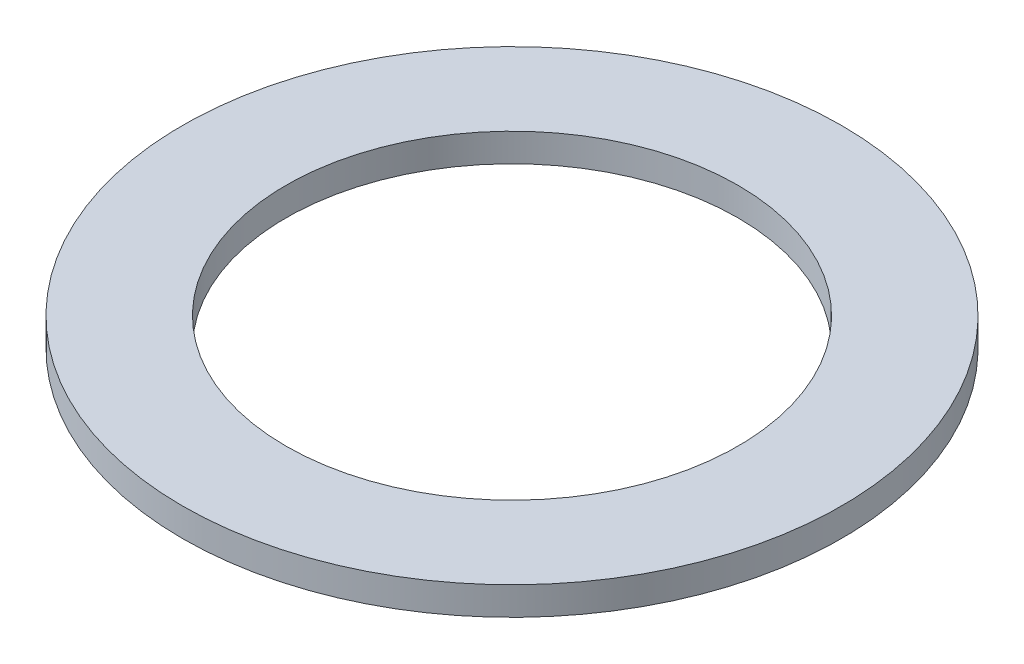
ISO-10303-21;
HEADER;
FILE_DESCRIPTION(('STEP AP214'),'2;1');
FILE_NAME('part.step','',(''),(''),'','','');
FILE_SCHEMA(('AUTOMOTIVE_DESIGN { 1 0 10303 214 1 1 1 1 }'));
ENDSEC;
DATA;
#1=APPLICATION_CONTEXT('core data for automotive mechanical design processes');
#2=APPLICATION_PROTOCOL_DEFINITION('international standard','automotive_design',2000,#1);
#3=PRODUCT_CONTEXT('',#1,'mechanical');
#4=PRODUCT('Part','Part','',(#3));
#5=PRODUCT_RELATED_PRODUCT_CATEGORY('part','',(#4));
#6=PRODUCT_DEFINITION_FORMATION('','',#4);
#7=PRODUCT_DEFINITION_CONTEXT('part definition',#1,'design');
#8=PRODUCT_DEFINITION('design','',#6,#7);
#9=PRODUCT_DEFINITION_SHAPE('','',#8);
#10=(LENGTH_UNIT() NAMED_UNIT(*) SI_UNIT(.MILLI.,.METRE.));
#11=(NAMED_UNIT(*) PLANE_ANGLE_UNIT() SI_UNIT($,.RADIAN.));
#12=(NAMED_UNIT(*) SI_UNIT($,.STERADIAN.) SOLID_ANGLE_UNIT());
#13=UNCERTAINTY_MEASURE_WITH_UNIT(LENGTH_MEASURE(1.E-05),#10,'distance_accuracy_value','');
#14=(GEOMETRIC_REPRESENTATION_CONTEXT(3) GLOBAL_UNCERTAINTY_ASSIGNED_CONTEXT((#13)) GLOBAL_UNIT_ASSIGNED_CONTEXT((#10,
#11,#12)) REPRESENTATION_CONTEXT('',''));
#15=CARTESIAN_POINT('',(0.,0.,0.));
#16=DIRECTION('',(0.,0.,1.));
#17=DIRECTION('',(1.,0.,0.));
#18=AXIS2_PLACEMENT_3D('',#15,#16,#17);
#19=CARTESIAN_POINT('',(0.,1.5,0.));
#20=DIRECTION('',(0.,1.,0.));
#21=DIRECTION('',(0.,0.,1.));
#22=AXIS2_PLACEMENT_3D('',#19,#20,#21);
#23=PLANE('',#22);
#24=CARTESIAN_POINT('',(0.,1.5,0.));
#25=DIRECTION('',(0.,1.,0.));
#26=DIRECTION('',(0.,0.,1.));
#27=AXIS2_PLACEMENT_3D('',#24,#25,#26);
#28=CIRCLE('',#27,17.5);
#29=CARTESIAN_POINT('',(0.,1.5,17.5));
#30=VERTEX_POINT('',#29);
#31=EDGE_CURVE('E12',#30,#30,#28,.T.);
#32=ORIENTED_EDGE('',*,*,#31,.T.);
#33=EDGE_LOOP('',(#32));
#34=FACE_BOUND('',#33,.T.);
#35=CARTESIAN_POINT('',(0.,1.5,0.));
#36=DIRECTION('',(0.,1.,0.));
#37=DIRECTION('',(0.,0.,1.));
#38=AXIS2_PLACEMENT_3D('',#35,#36,#37);
#39=CIRCLE('',#38,12.);
#40=CARTESIAN_POINT('',(0.,1.5,12.));
#41=VERTEX_POINT('',#40);
#42=EDGE_CURVE('E56',#41,#41,#39,.T.);
#43=ORIENTED_EDGE('',*,*,#42,.F.);
#44=EDGE_LOOP('',(#43));
#45=FACE_BOUND('',#44,.T.);
#46=ADVANCED_FACE('F45',(#34,#45),#23,.T.);
#47=CARTESIAN_POINT('',(0.,0.,0.));
#48=DIRECTION('',(0.,1.,0.));
#49=DIRECTION('',(0.,0.,1.));
#50=AXIS2_PLACEMENT_3D('',#47,#48,#49);
#51=PLANE('',#50);
#52=CARTESIAN_POINT('',(0.,0.,0.));
#53=DIRECTION('',(0.,1.,0.));
#54=DIRECTION('',(0.,0.,1.));
#55=AXIS2_PLACEMENT_3D('',#52,#53,#54);
#56=CIRCLE('',#55,17.5);
#57=CARTESIAN_POINT('',(0.,0.,17.5));
#58=VERTEX_POINT('',#57);
#59=EDGE_CURVE('E49',#58,#58,#56,.T.);
#60=ORIENTED_EDGE('',*,*,#59,.F.);
#61=EDGE_LOOP('',(#60));
#62=FACE_BOUND('',#61,.T.);
#63=CARTESIAN_POINT('',(0.,0.,0.));
#64=DIRECTION('',(0.,1.,0.));
#65=DIRECTION('',(0.,0.,1.));
#66=AXIS2_PLACEMENT_3D('',#63,#64,#65);
#67=CIRCLE('',#66,12.);
#68=CARTESIAN_POINT('',(0.,0.,12.));
#69=VERTEX_POINT('',#68);
#70=EDGE_CURVE('E58',#69,#69,#67,.T.);
#71=ORIENTED_EDGE('',*,*,#70,.T.);
#72=EDGE_LOOP('',(#71));
#73=FACE_BOUND('',#72,.T.);
#74=ADVANCED_FACE('F68',(#62,#73),#51,.F.);
#75=CARTESIAN_POINT('',(0.,1.5,0.));
#76=DIRECTION('',(0.,-1.,0.));
#77=DIRECTION('',(0.,0.,-1.));
#78=AXIS2_PLACEMENT_3D('',#75,#76,#77);
#79=CYLINDRICAL_SURFACE('',#78,17.5);
#80=ORIENTED_EDGE('',*,*,#31,.F.);
#81=EDGE_LOOP('',(#80));
#82=FACE_BOUND('',#81,.T.);
#83=ORIENTED_EDGE('',*,*,#59,.T.);
#84=EDGE_LOOP('',(#83));
#85=FACE_BOUND('',#84,.T.);
#86=ADVANCED_FACE('F47',(#82,#85),#79,.T.);
#87=CARTESIAN_POINT('',(0.,1.5,0.));
#88=DIRECTION('',(0.,-1.,0.));
#89=DIRECTION('',(0.,0.,-1.));
#90=AXIS2_PLACEMENT_3D('',#87,#88,#89);
#91=CYLINDRICAL_SURFACE('',#90,12.);
#92=ORIENTED_EDGE('',*,*,#42,.T.);
#93=EDGE_LOOP('',(#92));
#94=FACE_BOUND('',#93,.T.);
#95=ORIENTED_EDGE('',*,*,#70,.F.);
#96=EDGE_LOOP('',(#95));
#97=FACE_BOUND('',#96,.T.);
#98=ADVANCED_FACE('F64',(#94,#97),#91,.F.);
#99=CLOSED_SHELL('',(#46,#74,#86,#98));
#100=MANIFOLD_SOLID_BREP('B2',#99);
#101=ADVANCED_BREP_SHAPE_REPRESENTATION('',(#18,#100),#14);
#102=SHAPE_DEFINITION_REPRESENTATION(#9,#101);
ENDSEC;
END-ISO-10303-21;
